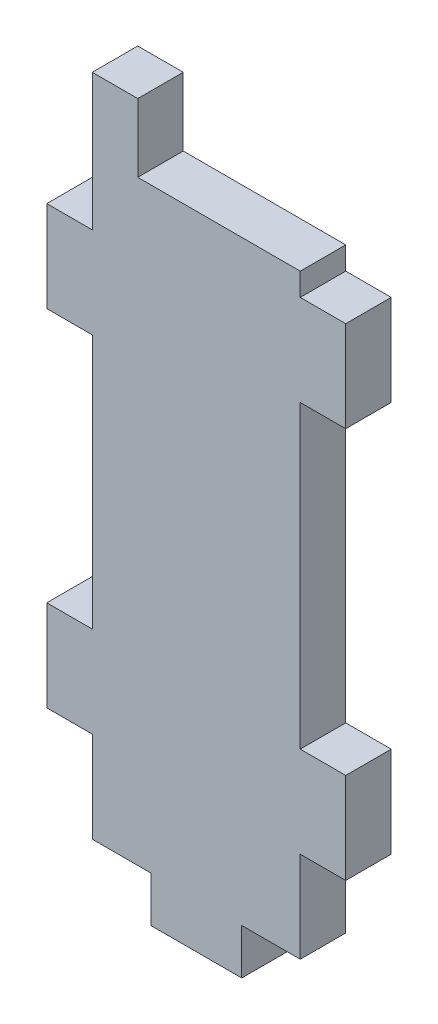
ISO-10303-21;
HEADER;
FILE_DESCRIPTION(('STEP AP214'),'2;1');
FILE_NAME('part.step','',(''),(''),'','','');
FILE_SCHEMA(('AUTOMOTIVE_DESIGN { 1 0 10303 214 1 1 1 1 }'));
ENDSEC;
DATA;
#1=APPLICATION_CONTEXT('core data for automotive mechanical design processes');
#2=APPLICATION_PROTOCOL_DEFINITION('international standard','automotive_design',2000,#1);
#3=PRODUCT_CONTEXT('',#1,'mechanical');
#4=PRODUCT('Part','Part','',(#3));
#5=PRODUCT_RELATED_PRODUCT_CATEGORY('part','',(#4));
#6=PRODUCT_DEFINITION_FORMATION('','',#4);
#7=PRODUCT_DEFINITION_CONTEXT('part definition',#1,'design');
#8=PRODUCT_DEFINITION('design','',#6,#7);
#9=PRODUCT_DEFINITION_SHAPE('','',#8);
#10=(LENGTH_UNIT() NAMED_UNIT(*) SI_UNIT(.MILLI.,.METRE.));
#11=(NAMED_UNIT(*) PLANE_ANGLE_UNIT() SI_UNIT($,.RADIAN.));
#12=(NAMED_UNIT(*) SI_UNIT($,.STERADIAN.) SOLID_ANGLE_UNIT());
#13=UNCERTAINTY_MEASURE_WITH_UNIT(LENGTH_MEASURE(1.E-05),#10,'distance_accuracy_value','');
#14=(GEOMETRIC_REPRESENTATION_CONTEXT(3) GLOBAL_UNCERTAINTY_ASSIGNED_CONTEXT((#13)) GLOBAL_UNIT_ASSIGNED_CONTEXT((#10,
#11,#12)) REPRESENTATION_CONTEXT('',''));
#15=CARTESIAN_POINT('',(0.,0.,0.));
#16=DIRECTION('',(0.,0.,1.));
#17=DIRECTION('',(1.,0.,0.));
#18=AXIS2_PLACEMENT_3D('',#15,#16,#17);
#19=CARTESIAN_POINT('',(175.817093211712,-37.0225831909852,5.));
#20=DIRECTION('',(0.,1.,0.));
#21=DIRECTION('',(0.,0.,1.));
#22=AXIS2_PLACEMENT_3D('',#19,#20,#21);
#23=PLANE('',#22);
#24=DIRECTION('',(0.,0.,1.));
#25=VECTOR('',#24,1.);
#26=CARTESIAN_POINT('',(164.387093211713,-37.0225831909852,0.));
#27=LINE('',#26,#25);
#28=CARTESIAN_POINT('',(164.387093211713,-37.0225831909852,0.));
#29=VERTEX_POINT('',#28);
#30=CARTESIAN_POINT('',(164.387093211713,-37.0225831909852,5.));
#31=VERTEX_POINT('',#30);
#32=EDGE_CURVE('E237',#29,#31,#27,.T.);
#33=ORIENTED_EDGE('',*,*,#32,.F.);
#34=DIRECTION('',(1.,0.,0.));
#35=VECTOR('',#34,1.);
#36=CARTESIAN_POINT('',(175.817093211712,-37.0225831909852,0.));
#37=LINE('',#36,#35);
#38=CARTESIAN_POINT('',(170.817093211712,-37.0225831909852,0.));
#39=VERTEX_POINT('',#38);
#40=EDGE_CURVE('E412',#29,#39,#37,.T.);
#41=ORIENTED_EDGE('',*,*,#40,.T.);
#42=DIRECTION('',(0.,0.,1.));
#43=VECTOR('',#42,1.);
#44=CARTESIAN_POINT('',(170.817093211712,-37.0225831909852,0.));
#45=LINE('',#44,#43);
#46=CARTESIAN_POINT('',(170.817093211712,-37.0225831909852,5.));
#47=VERTEX_POINT('',#46);
#48=EDGE_CURVE('E316',#39,#47,#45,.T.);
#49=ORIENTED_EDGE('',*,*,#48,.T.);
#50=DIRECTION('',(1.,0.,0.));
#51=VECTOR('',#50,1.);
#52=CARTESIAN_POINT('',(175.817093211712,-37.0225831909852,5.));
#53=LINE('',#52,#51);
#54=EDGE_CURVE('E41',#31,#47,#53,.T.);
#55=ORIENTED_EDGE('',*,*,#54,.F.);
#56=EDGE_LOOP('',(#33,#41,#49,#55));
#57=FACE_BOUND('',#56,.T.);
#58=ADVANCED_FACE('F32',(#57),#23,.F.);
#59=CARTESIAN_POINT('',(142.957093211713,35.9774168090148,5.));
#60=DIRECTION('',(1.,0.,0.));
#61=DIRECTION('',(0.,0.,-1.));
#62=AXIS2_PLACEMENT_3D('',#59,#60,#61);
#63=PLANE('',#62);
#64=DIRECTION('',(0.,-1.,0.));
#65=VECTOR('',#64,1.);
#66=CARTESIAN_POINT('',(142.957093211713,35.9774168090148,5.));
#67=LINE('',#66,#65);
#68=CARTESIAN_POINT('',(142.957093211713,20.9774168090148,5.));
#69=VERTEX_POINT('',#68);
#70=CARTESIAN_POINT('',(142.957093211713,10.9774168090148,5.));
#71=VERTEX_POINT('',#70);
#72=EDGE_CURVE('E397',#69,#71,#67,.T.);
#73=ORIENTED_EDGE('',*,*,#72,.F.);
#74=DIRECTION('',(0.,0.,1.));
#75=VECTOR('',#74,1.);
#76=CARTESIAN_POINT('',(142.957093211713,20.9774168090148,0.));
#77=LINE('',#76,#75);
#78=CARTESIAN_POINT('',(142.957093211713,20.9774168090148,0.));
#79=VERTEX_POINT('',#78);
#80=EDGE_CURVE('E251',#79,#69,#77,.T.);
#81=ORIENTED_EDGE('',*,*,#80,.F.);
#82=DIRECTION('',(0.,-1.,0.));
#83=VECTOR('',#82,1.);
#84=CARTESIAN_POINT('',(142.957093211713,35.9774168090148,0.));
#85=LINE('',#84,#83);
#86=CARTESIAN_POINT('',(142.957093211713,10.9774168090148,0.));
#87=VERTEX_POINT('',#86);
#88=EDGE_CURVE('E409',#79,#87,#85,.T.);
#89=ORIENTED_EDGE('',*,*,#88,.T.);
#90=DIRECTION('',(0.,0.,1.));
#91=VECTOR('',#90,1.);
#92=CARTESIAN_POINT('',(142.957093211713,10.9774168090148,0.));
#93=LINE('',#92,#91);
#94=EDGE_CURVE('E273',#87,#71,#93,.T.);
#95=ORIENTED_EDGE('',*,*,#94,.T.);
#96=EDGE_LOOP('',(#73,#81,#89,#95));
#97=FACE_BOUND('',#96,.T.);
#98=ADVANCED_FACE('F489',(#97),#63,.F.);
#99=CARTESIAN_POINT('',(175.817093211712,35.9774168090148,5.));
#100=DIRECTION('',(-1.,0.,0.));
#101=DIRECTION('',(0.,0.,1.));
#102=AXIS2_PLACEMENT_3D('',#99,#100,#101);
#103=PLANE('',#102);
#104=DIRECTION('',(0.,1.,0.));
#105=VECTOR('',#104,1.);
#106=CARTESIAN_POINT('',(175.817093211712,35.9774168090148,5.));
#107=LINE('',#106,#105);
#108=CARTESIAN_POINT('',(175.817093211712,15.9774168090148,5.));
#109=VERTEX_POINT('',#108);
#110=CARTESIAN_POINT('',(175.817093211712,25.9774168090148,5.));
#111=VERTEX_POINT('',#110);
#112=EDGE_CURVE('E393',#109,#111,#107,.T.);
#113=ORIENTED_EDGE('',*,*,#112,.F.);
#114=DIRECTION('',(0.,0.,1.));
#115=VECTOR('',#114,1.);
#116=CARTESIAN_POINT('',(175.817093211712,15.9774168090148,0.));
#117=LINE('',#116,#115);
#118=CARTESIAN_POINT('',(175.817093211712,15.9774168090148,0.));
#119=VERTEX_POINT('',#118);
#120=EDGE_CURVE('E349',#119,#109,#117,.T.);
#121=ORIENTED_EDGE('',*,*,#120,.F.);
#122=DIRECTION('',(0.,1.,0.));
#123=VECTOR('',#122,1.);
#124=CARTESIAN_POINT('',(175.817093211712,35.9774168090148,0.));
#125=LINE('',#124,#123);
#126=CARTESIAN_POINT('',(175.817093211712,25.9774168090148,0.));
#127=VERTEX_POINT('',#126);
#128=EDGE_CURVE('E381',#119,#127,#125,.T.);
#129=ORIENTED_EDGE('',*,*,#128,.T.);
#130=DIRECTION('',(0.,0.,1.));
#131=VECTOR('',#130,1.);
#132=CARTESIAN_POINT('',(175.817093211712,25.9774168090148,0.));
#133=LINE('',#132,#131);
#134=EDGE_CURVE('E384',#127,#111,#133,.T.);
#135=ORIENTED_EDGE('',*,*,#134,.T.);
#136=EDGE_LOOP('',(#113,#121,#129,#135));
#137=FACE_BOUND('',#136,.T.);
#138=ADVANCED_FACE('F443',(#137),#103,.F.);
#139=CARTESIAN_POINT('',(175.817093211712,-27.0225831909852,5.));
#140=VERTEX_POINT('',#139);
#141=CARTESIAN_POINT('',(175.817093211712,-17.0225831909852,5.));
#142=VERTEX_POINT('',#141);
#143=EDGE_CURVE('E390',#140,#142,#107,.T.);
#144=ORIENTED_EDGE('',*,*,#143,.F.);
#145=DIRECTION('',(0.,0.,1.));
#146=VECTOR('',#145,1.);
#147=CARTESIAN_POINT('',(175.817093211712,-27.0225831909852,0.));
#148=LINE('',#147,#146);
#149=CARTESIAN_POINT('',(175.817093211712,-27.0225831909852,0.));
#150=VERTEX_POINT('',#149);
#151=EDGE_CURVE('E324',#150,#140,#148,.T.);
#152=ORIENTED_EDGE('',*,*,#151,.F.);
#153=CARTESIAN_POINT('',(175.817093211712,-17.0225831909852,0.));
#154=VERTEX_POINT('',#153);
#155=EDGE_CURVE('E401',#150,#154,#125,.T.);
#156=ORIENTED_EDGE('',*,*,#155,.T.);
#157=DIRECTION('',(0.,0.,1.));
#158=VECTOR('',#157,1.);
#159=CARTESIAN_POINT('',(175.817093211712,-17.0225831909852,0.));
#160=LINE('',#159,#158);
#161=EDGE_CURVE('E351',#154,#142,#160,.T.);
#162=ORIENTED_EDGE('',*,*,#161,.T.);
#163=EDGE_LOOP('',(#144,#152,#156,#162));
#164=FACE_BOUND('',#163,.T.);
#165=ADVANCED_FACE('F34',(#164),#103,.F.);
#166=CARTESIAN_POINT('',(175.817093211712,35.9774168090148,5.));
#167=DIRECTION('',(0.,-1.,0.));
#168=DIRECTION('',(0.,0.,-1.));
#169=AXIS2_PLACEMENT_3D('',#166,#167,#168);
#170=PLANE('',#169);
#171=DIRECTION('',(-1.,0.,0.));
#172=VECTOR('',#171,1.);
#173=CARTESIAN_POINT('',(175.817093211712,35.9774168090148,0.));
#174=LINE('',#173,#172);
#175=CARTESIAN_POINT('',(152.957093211713,35.9774168090148,0.));
#176=VERTEX_POINT('',#175);
#177=CARTESIAN_POINT('',(147.957093211713,35.9774168090148,0.));
#178=VERTEX_POINT('',#177);
#179=EDGE_CURVE('E425',#176,#178,#174,.T.);
#180=ORIENTED_EDGE('',*,*,#179,.T.);
#181=DIRECTION('',(0.,0.,1.));
#182=VECTOR('',#181,1.);
#183=CARTESIAN_POINT('',(147.957093211713,35.9774168090148,0.));
#184=LINE('',#183,#182);
#185=CARTESIAN_POINT('',(147.957093211713,35.9774168090148,5.));
#186=VERTEX_POINT('',#185);
#187=EDGE_CURVE('E256',#178,#186,#184,.T.);
#188=ORIENTED_EDGE('',*,*,#187,.T.);
#189=DIRECTION('',(-1.,0.,0.));
#190=VECTOR('',#189,1.);
#191=CARTESIAN_POINT('',(175.817093211712,35.9774168090148,5.));
#192=LINE('',#191,#190);
#193=CARTESIAN_POINT('',(152.957093211713,35.9774168090148,5.));
#194=VERTEX_POINT('',#193);
#195=EDGE_CURVE('E392',#194,#186,#192,.T.);
#196=ORIENTED_EDGE('',*,*,#195,.F.);
#197=DIRECTION('',(0.,0.,1.));
#198=VECTOR('',#197,1.);
#199=CARTESIAN_POINT('',(152.957093211713,35.9774168090148,0.));
#200=LINE('',#199,#198);
#201=EDGE_CURVE('E382',#176,#194,#200,.T.);
#202=ORIENTED_EDGE('',*,*,#201,.F.);
#203=EDGE_LOOP('',(#180,#188,#196,#202));
#204=FACE_BOUND('',#203,.T.);
#205=ADVANCED_FACE('F504',(#204),#170,.F.);
#206=CARTESIAN_POINT('',(142.957093211713,-17.0225831909852,5.));
#207=VERTEX_POINT('',#206);
#208=CARTESIAN_POINT('',(142.957093211713,-27.0225831909852,5.));
#209=VERTEX_POINT('',#208);
#210=EDGE_CURVE('E396',#207,#209,#67,.T.);
#211=ORIENTED_EDGE('',*,*,#210,.F.);
#212=DIRECTION('',(0.,0.,1.));
#213=VECTOR('',#212,1.);
#214=CARTESIAN_POINT('',(142.957093211713,-17.0225831909852,0.));
#215=LINE('',#214,#213);
#216=CARTESIAN_POINT('',(142.957093211713,-17.0225831909852,0.));
#217=VERTEX_POINT('',#216);
#218=EDGE_CURVE('E286',#217,#207,#215,.T.);
#219=ORIENTED_EDGE('',*,*,#218,.F.);
#220=CARTESIAN_POINT('',(142.957093211713,-27.0225831909852,0.));
#221=VERTEX_POINT('',#220);
#222=EDGE_CURVE('E420',#217,#221,#85,.T.);
#223=ORIENTED_EDGE('',*,*,#222,.T.);
#224=DIRECTION('',(0.,0.,1.));
#225=VECTOR('',#224,1.);
#226=CARTESIAN_POINT('',(142.957093211713,-27.0225831909852,0.));
#227=LINE('',#226,#225);
#228=EDGE_CURVE('E297',#221,#209,#227,.T.);
#229=ORIENTED_EDGE('',*,*,#228,.T.);
#230=EDGE_LOOP('',(#211,#219,#223,#229));
#231=FACE_BOUND('',#230,.T.);
#232=ADVANCED_FACE('F496',(#231),#63,.F.);
#233=CARTESIAN_POINT('',(147.957093211713,-37.0225831909852,0.));
#234=VERTEX_POINT('',#233);
#235=CARTESIAN_POINT('',(154.387093211713,-37.0225831909852,0.));
#236=VERTEX_POINT('',#235);
#237=EDGE_CURVE('E414',#234,#236,#37,.T.);
#238=ORIENTED_EDGE('',*,*,#237,.T.);
#239=DIRECTION('',(0.,0.,1.));
#240=VECTOR('',#239,1.);
#241=CARTESIAN_POINT('',(154.387093211713,-37.0225831909852,0.));
#242=LINE('',#241,#240);
#243=CARTESIAN_POINT('',(154.387093211713,-37.0225831909852,5.));
#244=VERTEX_POINT('',#243);
#245=EDGE_CURVE('E227',#236,#244,#242,.T.);
#246=ORIENTED_EDGE('',*,*,#245,.T.);
#247=CARTESIAN_POINT('',(147.957093211713,-37.0225831909852,5.));
#248=VERTEX_POINT('',#247);
#249=EDGE_CURVE('E11',#248,#244,#53,.T.);
#250=ORIENTED_EDGE('',*,*,#249,.F.);
#251=DIRECTION('',(0.,0.,1.));
#252=VECTOR('',#251,1.);
#253=CARTESIAN_POINT('',(147.957093211713,-37.0225831909852,0.));
#254=LINE('',#253,#252);
#255=EDGE_CURVE('E305',#234,#248,#254,.T.);
#256=ORIENTED_EDGE('',*,*,#255,.F.);
#257=EDGE_LOOP('',(#238,#246,#250,#256));
#258=FACE_BOUND('',#257,.T.);
#259=ADVANCED_FACE('F491',(#258),#23,.F.);
#260=CARTESIAN_POINT('',(0.,0.,5.));
#261=DIRECTION('',(0.,0.,-1.));
#262=DIRECTION('',(-1.,0.,0.));
#263=AXIS2_PLACEMENT_3D('',#260,#261,#262);
#264=PLANE('',#263);
#265=ORIENTED_EDGE('',*,*,#195,.T.);
#266=DIRECTION('',(0.,1.,0.));
#267=VECTOR('',#266,1.);
#268=CARTESIAN_POINT('',(147.957093211713,35.9774168090148,5.));
#269=LINE('',#268,#267);
#270=CARTESIAN_POINT('',(147.957093211713,20.9774168090148,5.));
#271=VERTEX_POINT('',#270);
#272=EDGE_CURVE('E249',#271,#186,#269,.T.);
#273=ORIENTED_EDGE('',*,*,#272,.F.);
#274=DIRECTION('',(1.,0.,0.));
#275=VECTOR('',#274,1.);
#276=CARTESIAN_POINT('',(147.957093211713,20.9774168090148,5.));
#277=LINE('',#276,#275);
#278=EDGE_CURVE('E252',#69,#271,#277,.T.);
#279=ORIENTED_EDGE('',*,*,#278,.F.);
#280=ORIENTED_EDGE('',*,*,#72,.T.);
#281=DIRECTION('',(-1.,0.,0.));
#282=VECTOR('',#281,1.);
#283=CARTESIAN_POINT('',(147.957093211713,10.9774168090148,5.));
#284=LINE('',#283,#282);
#285=CARTESIAN_POINT('',(147.957093211713,10.9774168090148,5.));
#286=VERTEX_POINT('',#285);
#287=EDGE_CURVE('E259',#286,#71,#284,.T.);
#288=ORIENTED_EDGE('',*,*,#287,.F.);
#289=DIRECTION('',(0.,1.,0.));
#290=VECTOR('',#289,1.);
#291=CARTESIAN_POINT('',(147.957093211713,10.9774168090148,5.));
#292=LINE('',#291,#290);
#293=CARTESIAN_POINT('',(147.957093211713,-17.0225831909852,5.));
#294=VERTEX_POINT('',#293);
#295=EDGE_CURVE('E267',#294,#286,#292,.T.);
#296=ORIENTED_EDGE('',*,*,#295,.F.);
#297=DIRECTION('',(1.,0.,0.));
#298=VECTOR('',#297,1.);
#299=CARTESIAN_POINT('',(147.957093211713,-17.0225831909852,5.));
#300=LINE('',#299,#298);
#301=EDGE_CURVE('E276',#207,#294,#300,.T.);
#302=ORIENTED_EDGE('',*,*,#301,.F.);
#303=ORIENTED_EDGE('',*,*,#210,.T.);
#304=DIRECTION('',(-1.,0.,0.));
#305=VECTOR('',#304,1.);
#306=CARTESIAN_POINT('',(147.957093211713,-27.0225831909852,5.));
#307=LINE('',#306,#305);
#308=CARTESIAN_POINT('',(147.957093211713,-27.0225831909852,5.));
#309=VERTEX_POINT('',#308);
#310=EDGE_CURVE('E283',#309,#209,#307,.T.);
#311=ORIENTED_EDGE('',*,*,#310,.F.);
#312=DIRECTION('',(0.,1.,0.));
#313=VECTOR('',#312,1.);
#314=CARTESIAN_POINT('',(147.957093211713,-27.0225831909852,5.));
#315=LINE('',#314,#313);
#316=EDGE_CURVE('E294',#248,#309,#315,.T.);
#317=ORIENTED_EDGE('',*,*,#316,.F.);
#318=ORIENTED_EDGE('',*,*,#249,.T.);
#319=DIRECTION('',(0.,-1.,0.));
#320=VECTOR('',#319,1.);
#321=CARTESIAN_POINT('',(154.387093211713,-37.0225831909852,5.));
#322=LINE('',#321,#320);
#323=CARTESIAN_POINT('',(154.387093211713,-42.0225831909852,5.));
#324=VERTEX_POINT('',#323);
#325=EDGE_CURVE('E49',#244,#324,#322,.T.);
#326=ORIENTED_EDGE('',*,*,#325,.T.);
#327=DIRECTION('',(1.,0.,0.));
#328=VECTOR('',#327,1.);
#329=CARTESIAN_POINT('',(154.387093211713,-42.0225831909852,5.));
#330=LINE('',#329,#328);
#331=CARTESIAN_POINT('',(164.387093211713,-42.0225831909852,5.));
#332=VERTEX_POINT('',#331);
#333=EDGE_CURVE('E212',#324,#332,#330,.T.);
#334=ORIENTED_EDGE('',*,*,#333,.T.);
#335=DIRECTION('',(0.,1.,0.));
#336=VECTOR('',#335,1.);
#337=CARTESIAN_POINT('',(164.387093211713,-37.0225831909852,5.));
#338=LINE('',#337,#336);
#339=EDGE_CURVE('E228',#332,#31,#338,.T.);
#340=ORIENTED_EDGE('',*,*,#339,.T.);
#341=ORIENTED_EDGE('',*,*,#54,.T.);
#342=DIRECTION('',(0.,-1.,0.));
#343=VECTOR('',#342,1.);
#344=CARTESIAN_POINT('',(170.817093211712,-27.0225831909852,5.));
#345=LINE('',#344,#343);
#346=CARTESIAN_POINT('',(170.817093211712,-27.0225831909852,5.));
#347=VERTEX_POINT('',#346);
#348=EDGE_CURVE('E304',#347,#47,#345,.T.);
#349=ORIENTED_EDGE('',*,*,#348,.F.);
#350=DIRECTION('',(-1.,0.,0.));
#351=VECTOR('',#350,1.);
#352=CARTESIAN_POINT('',(170.817093211712,-27.0225831909852,5.));
#353=LINE('',#352,#351);
#354=EDGE_CURVE('E313',#140,#347,#353,.T.);
#355=ORIENTED_EDGE('',*,*,#354,.F.);
#356=ORIENTED_EDGE('',*,*,#143,.T.);
#357=DIRECTION('',(1.,0.,0.));
#358=VECTOR('',#357,1.);
#359=CARTESIAN_POINT('',(170.817093211712,-17.0225831909852,5.));
#360=LINE('',#359,#358);
#361=CARTESIAN_POINT('',(170.817093211712,-17.0225831909852,5.));
#362=VERTEX_POINT('',#361);
#363=EDGE_CURVE('E341',#362,#142,#360,.T.);
#364=ORIENTED_EDGE('',*,*,#363,.F.);
#365=DIRECTION('',(0.,-1.,0.));
#366=VECTOR('',#365,1.);
#367=CARTESIAN_POINT('',(170.817093211712,15.9774168090148,5.));
#368=LINE('',#367,#366);
#369=CARTESIAN_POINT('',(170.817093211712,15.9774168090148,5.));
#370=VERTEX_POINT('',#369);
#371=EDGE_CURVE('E323',#370,#362,#368,.T.);
#372=ORIENTED_EDGE('',*,*,#371,.F.);
#373=DIRECTION('',(-1.,0.,0.));
#374=VECTOR('',#373,1.);
#375=CARTESIAN_POINT('',(170.817093211712,15.9774168090148,5.));
#376=LINE('',#375,#374);
#377=EDGE_CURVE('E332',#109,#370,#376,.T.);
#378=ORIENTED_EDGE('',*,*,#377,.F.);
#379=ORIENTED_EDGE('',*,*,#112,.T.);
#380=DIRECTION('',(1.,0.,0.));
#381=VECTOR('',#380,1.);
#382=CARTESIAN_POINT('',(170.817093211712,25.9774168090148,5.));
#383=LINE('',#382,#381);
#384=CARTESIAN_POINT('',(170.817093211712,25.9774168090148,5.));
#385=VERTEX_POINT('',#384);
#386=EDGE_CURVE('E374',#385,#111,#383,.T.);
#387=ORIENTED_EDGE('',*,*,#386,.F.);
#388=DIRECTION('',(-1.33226762955018E-13,-1.,0.));
#389=VECTOR('',#388,1.);
#390=CARTESIAN_POINT('',(170.817093211712,25.9774168090148,5.));
#391=LINE('',#390,#389);
#392=CARTESIAN_POINT('',(170.817093211712,28.4774168090148,5.));
#393=VERTEX_POINT('',#392);
#394=EDGE_CURVE('E371',#393,#385,#391,.T.);
#395=ORIENTED_EDGE('',*,*,#394,.F.);
#396=DIRECTION('',(1.,0.,0.));
#397=VECTOR('',#396,1.);
#398=CARTESIAN_POINT('',(170.817093211712,28.4774168090148,5.));
#399=LINE('',#398,#397);
#400=CARTESIAN_POINT('',(152.957093211713,28.4774168090148,5.));
#401=VERTEX_POINT('',#400);
#402=EDGE_CURVE('E348',#401,#393,#399,.T.);
#403=ORIENTED_EDGE('',*,*,#402,.F.);
#404=DIRECTION('',(0.,-1.,0.));
#405=VECTOR('',#404,1.);
#406=CARTESIAN_POINT('',(152.957093211713,28.4774168090148,5.));
#407=LINE('',#406,#405);
#408=EDGE_CURVE('E359',#194,#401,#407,.T.);
#409=ORIENTED_EDGE('',*,*,#408,.F.);
#410=EDGE_LOOP('',(#265,#273,#279,#280,#288,#296,#302,#303,#311,#317,#318,#326,#334,#340,#341,
#349,#355,#356,#364,#372,#378,#379,#387,#395,#403,#409));
#411=FACE_BOUND('',#410,.T.);
#412=ADVANCED_FACE('F455',(#411),#264,.F.);
#413=CARTESIAN_POINT('',(0.,0.,0.));
#414=DIRECTION('',(0.,0.,-1.));
#415=DIRECTION('',(-1.,0.,0.));
#416=AXIS2_PLACEMENT_3D('',#413,#414,#415);
#417=PLANE('',#416);
#418=DIRECTION('',(0.,1.,0.));
#419=VECTOR('',#418,1.);
#420=CARTESIAN_POINT('',(147.957093211713,35.9774168090148,0.));
#421=LINE('',#420,#419);
#422=CARTESIAN_POINT('',(147.957093211713,20.9774168090148,0.));
#423=VERTEX_POINT('',#422);
#424=EDGE_CURVE('E57',#423,#178,#421,.T.);
#425=ORIENTED_EDGE('',*,*,#424,.T.);
#426=ORIENTED_EDGE('',*,*,#179,.F.);
#427=DIRECTION('',(0.,-1.,0.));
#428=VECTOR('',#427,1.);
#429=CARTESIAN_POINT('',(152.957093211713,28.4774168090148,0.));
#430=LINE('',#429,#428);
#431=CARTESIAN_POINT('',(152.957093211713,28.4774168090148,0.));
#432=VERTEX_POINT('',#431);
#433=EDGE_CURVE('E365',#176,#432,#430,.T.);
#434=ORIENTED_EDGE('',*,*,#433,.T.);
#435=DIRECTION('',(1.,0.,0.));
#436=VECTOR('',#435,1.);
#437=CARTESIAN_POINT('',(170.817093211712,28.4774168090148,0.));
#438=LINE('',#437,#436);
#439=CARTESIAN_POINT('',(170.817093211712,28.4774168090148,0.));
#440=VERTEX_POINT('',#439);
#441=EDGE_CURVE('E355',#432,#440,#438,.T.);
#442=ORIENTED_EDGE('',*,*,#441,.T.);
#443=DIRECTION('',(-1.33226762955018E-13,-1.,0.));
#444=VECTOR('',#443,1.);
#445=CARTESIAN_POINT('',(170.817093211712,25.9774168090148,0.));
#446=LINE('',#445,#444);
#447=CARTESIAN_POINT('',(170.817093211712,25.9774168090148,0.));
#448=VERTEX_POINT('',#447);
#449=EDGE_CURVE('E358',#440,#448,#446,.T.);
#450=ORIENTED_EDGE('',*,*,#449,.T.);
#451=DIRECTION('',(1.,0.,0.));
#452=VECTOR('',#451,1.);
#453=CARTESIAN_POINT('',(170.817093211712,25.9774168090148,0.));
#454=LINE('',#453,#452);
#455=EDGE_CURVE('E362',#448,#127,#454,.T.);
#456=ORIENTED_EDGE('',*,*,#455,.T.);
#457=ORIENTED_EDGE('',*,*,#128,.F.);
#458=DIRECTION('',(-1.,0.,0.));
#459=VECTOR('',#458,1.);
#460=CARTESIAN_POINT('',(170.817093211712,15.9774168090148,0.));
#461=LINE('',#460,#459);
#462=CARTESIAN_POINT('',(170.817093211712,15.9774168090148,0.));
#463=VERTEX_POINT('',#462);
#464=EDGE_CURVE('E335',#119,#463,#461,.T.);
#465=ORIENTED_EDGE('',*,*,#464,.T.);
#466=DIRECTION('',(0.,-1.,0.));
#467=VECTOR('',#466,1.);
#468=CARTESIAN_POINT('',(170.817093211712,15.9774168090148,0.));
#469=LINE('',#468,#467);
#470=CARTESIAN_POINT('',(170.817093211712,-17.0225831909852,0.));
#471=VERTEX_POINT('',#470);
#472=EDGE_CURVE('E328',#463,#471,#469,.T.);
#473=ORIENTED_EDGE('',*,*,#472,.T.);
#474=DIRECTION('',(1.,0.,0.));
#475=VECTOR('',#474,1.);
#476=CARTESIAN_POINT('',(170.817093211712,-17.0225831909852,0.));
#477=LINE('',#476,#475);
#478=EDGE_CURVE('E331',#471,#154,#477,.T.);
#479=ORIENTED_EDGE('',*,*,#478,.T.);
#480=ORIENTED_EDGE('',*,*,#155,.F.);
#481=DIRECTION('',(-1.,0.,0.));
#482=VECTOR('',#481,1.);
#483=CARTESIAN_POINT('',(170.817093211712,-27.0225831909852,0.));
#484=LINE('',#483,#482);
#485=CARTESIAN_POINT('',(170.817093211712,-27.0225831909852,0.));
#486=VERTEX_POINT('',#485);
#487=EDGE_CURVE('E312',#150,#486,#484,.T.);
#488=ORIENTED_EDGE('',*,*,#487,.T.);
#489=DIRECTION('',(0.,-1.,0.));
#490=VECTOR('',#489,1.);
#491=CARTESIAN_POINT('',(170.817093211712,-27.0225831909852,0.));
#492=LINE('',#491,#490);
#493=EDGE_CURVE('E309',#486,#39,#492,.T.);
#494=ORIENTED_EDGE('',*,*,#493,.T.);
#495=ORIENTED_EDGE('',*,*,#40,.F.);
#496=DIRECTION('',(0.,1.,0.));
#497=VECTOR('',#496,1.);
#498=CARTESIAN_POINT('',(164.387093211713,-37.0225831909852,0.));
#499=LINE('',#498,#497);
#500=CARTESIAN_POINT('',(164.387093211713,-42.0225831909852,0.));
#501=VERTEX_POINT('',#500);
#502=EDGE_CURVE('E215',#501,#29,#499,.T.);
#503=ORIENTED_EDGE('',*,*,#502,.F.);
#504=DIRECTION('',(1.,0.,0.));
#505=VECTOR('',#504,1.);
#506=CARTESIAN_POINT('',(154.387093211713,-42.0225831909852,0.));
#507=LINE('',#506,#505);
#508=CARTESIAN_POINT('',(154.387093211713,-42.0225831909852,0.));
#509=VERTEX_POINT('',#508);
#510=EDGE_CURVE('E210',#509,#501,#507,.T.);
#511=ORIENTED_EDGE('',*,*,#510,.F.);
#512=DIRECTION('',(0.,-1.,0.));
#513=VECTOR('',#512,1.);
#514=CARTESIAN_POINT('',(154.387093211713,-37.0225831909852,0.));
#515=LINE('',#514,#513);
#516=EDGE_CURVE('E222',#236,#509,#515,.T.);
#517=ORIENTED_EDGE('',*,*,#516,.F.);
#518=ORIENTED_EDGE('',*,*,#237,.F.);
#519=DIRECTION('',(0.,1.,0.));
#520=VECTOR('',#519,1.);
#521=CARTESIAN_POINT('',(147.957093211713,-27.0225831909852,0.));
#522=LINE('',#521,#520);
#523=CARTESIAN_POINT('',(147.957093211713,-27.0225831909852,0.));
#524=VERTEX_POINT('',#523);
#525=EDGE_CURVE('E293',#234,#524,#522,.T.);
#526=ORIENTED_EDGE('',*,*,#525,.T.);
#527=DIRECTION('',(-1.,0.,0.));
#528=VECTOR('',#527,1.);
#529=CARTESIAN_POINT('',(147.957093211713,-27.0225831909852,0.));
#530=LINE('',#529,#528);
#531=EDGE_CURVE('E290',#524,#221,#530,.T.);
#532=ORIENTED_EDGE('',*,*,#531,.T.);
#533=ORIENTED_EDGE('',*,*,#222,.F.);
#534=DIRECTION('',(1.,0.,0.));
#535=VECTOR('',#534,1.);
#536=CARTESIAN_POINT('',(147.957093211713,-17.0225831909852,0.));
#537=LINE('',#536,#535);
#538=CARTESIAN_POINT('',(147.957093211713,-17.0225831909852,0.));
#539=VERTEX_POINT('',#538);
#540=EDGE_CURVE('E266',#217,#539,#537,.T.);
#541=ORIENTED_EDGE('',*,*,#540,.T.);
#542=DIRECTION('',(0.,1.,0.));
#543=VECTOR('',#542,1.);
#544=CARTESIAN_POINT('',(147.957093211713,10.9774168090148,0.));
#545=LINE('',#544,#543);
#546=CARTESIAN_POINT('',(147.957093211713,10.9774168090148,0.));
#547=VERTEX_POINT('',#546);
#548=EDGE_CURVE('E270',#539,#547,#545,.T.);
#549=ORIENTED_EDGE('',*,*,#548,.T.);
#550=DIRECTION('',(-1.,0.,0.));
#551=VECTOR('',#550,1.);
#552=CARTESIAN_POINT('',(147.957093211713,10.9774168090148,0.));
#553=LINE('',#552,#551);
#554=EDGE_CURVE('E263',#547,#87,#553,.T.);
#555=ORIENTED_EDGE('',*,*,#554,.T.);
#556=ORIENTED_EDGE('',*,*,#88,.F.);
#557=DIRECTION('',(1.,0.,0.));
#558=VECTOR('',#557,1.);
#559=CARTESIAN_POINT('',(147.957093211713,20.9774168090148,0.));
#560=LINE('',#559,#558);
#561=EDGE_CURVE('E246',#79,#423,#560,.T.);
#562=ORIENTED_EDGE('',*,*,#561,.T.);
#563=EDGE_LOOP('',(#425,#426,#434,#442,#450,#456,#457,#465,#473,#479,#480,#488,#494,#495,#503,
#511,#517,#518,#526,#532,#533,#541,#549,#555,#556,#562));
#564=FACE_BOUND('',#563,.T.);
#565=ADVANCED_FACE('F220',(#564),#417,.T.);
#566=CARTESIAN_POINT('',(170.817093211712,28.4774168090148,0.));
#567=DIRECTION('',(0.,-1.,0.));
#568=DIRECTION('',(1.,0.,0.));
#569=AXIS2_PLACEMENT_3D('',#566,#567,#568);
#570=PLANE('',#569);
#571=ORIENTED_EDGE('',*,*,#402,.T.);
#572=DIRECTION('',(0.,0.,1.));
#573=VECTOR('',#572,1.);
#574=CARTESIAN_POINT('',(170.817093211712,28.4774168090148,0.));
#575=LINE('',#574,#573);
#576=EDGE_CURVE('E368',#440,#393,#575,.T.);
#577=ORIENTED_EDGE('',*,*,#576,.F.);
#578=ORIENTED_EDGE('',*,*,#441,.F.);
#579=DIRECTION('',(0.,0.,1.));
#580=VECTOR('',#579,1.);
#581=CARTESIAN_POINT('',(152.957093211713,28.4774168090148,0.));
#582=LINE('',#581,#580);
#583=EDGE_CURVE('E379',#432,#401,#582,.T.);
#584=ORIENTED_EDGE('',*,*,#583,.T.);
#585=EDGE_LOOP('',(#571,#577,#578,#584));
#586=FACE_BOUND('',#585,.T.);
#587=ADVANCED_FACE('F538',(#586),#570,.F.);
#588=CARTESIAN_POINT('',(152.957093211713,28.4774168090148,0.));
#589=DIRECTION('',(-1.,0.,0.));
#590=DIRECTION('',(0.,0.,1.));
#591=AXIS2_PLACEMENT_3D('',#588,#589,#590);
#592=PLANE('',#591);
#593=ORIENTED_EDGE('',*,*,#408,.T.);
#594=ORIENTED_EDGE('',*,*,#583,.F.);
#595=ORIENTED_EDGE('',*,*,#433,.F.);
#596=ORIENTED_EDGE('',*,*,#201,.T.);
#597=EDGE_LOOP('',(#593,#594,#595,#596));
#598=FACE_BOUND('',#597,.T.);
#599=ADVANCED_FACE('F536',(#598),#592,.F.);
#600=CARTESIAN_POINT('',(170.817093211712,25.9774168090148,0.));
#601=DIRECTION('',(0.,-1.,0.));
#602=DIRECTION('',(0.,0.,-1.));
#603=AXIS2_PLACEMENT_3D('',#600,#601,#602);
#604=PLANE('',#603);
#605=ORIENTED_EDGE('',*,*,#386,.T.);
#606=ORIENTED_EDGE('',*,*,#134,.F.);
#607=ORIENTED_EDGE('',*,*,#455,.F.);
#608=DIRECTION('',(0.,0.,1.));
#609=VECTOR('',#608,1.);
#610=CARTESIAN_POINT('',(170.817093211712,25.9774168090148,0.));
#611=LINE('',#610,#609);
#612=EDGE_CURVE('E387',#448,#385,#611,.T.);
#613=ORIENTED_EDGE('',*,*,#612,.T.);
#614=EDGE_LOOP('',(#605,#606,#607,#613));
#615=FACE_BOUND('',#614,.T.);
#616=ADVANCED_FACE('F445',(#615),#604,.F.);
#617=CARTESIAN_POINT('',(170.817093211712,25.9774168090148,0.));
#618=DIRECTION('',(-1.,1.33226762955018E-13,0.));
#619=DIRECTION('',(-1.33226762955018E-13,-1.,0.));
#620=AXIS2_PLACEMENT_3D('',#617,#618,#619);
#621=PLANE('',#620);
#622=ORIENTED_EDGE('',*,*,#394,.T.);
#623=ORIENTED_EDGE('',*,*,#612,.F.);
#624=ORIENTED_EDGE('',*,*,#449,.F.);
#625=ORIENTED_EDGE('',*,*,#576,.T.);
#626=EDGE_LOOP('',(#622,#623,#624,#625));
#627=FACE_BOUND('',#626,.T.);
#628=ADVANCED_FACE('F451',(#627),#621,.F.);
#629=CARTESIAN_POINT('',(170.817093211712,15.9774168090148,0.));
#630=DIRECTION('',(-1.,0.,0.));
#631=DIRECTION('',(0.,0.,1.));
#632=AXIS2_PLACEMENT_3D('',#629,#630,#631);
#633=PLANE('',#632);
#634=ORIENTED_EDGE('',*,*,#371,.T.);
#635=DIRECTION('',(0.,0.,1.));
#636=VECTOR('',#635,1.);
#637=CARTESIAN_POINT('',(170.817093211712,-17.0225831909852,0.));
#638=LINE('',#637,#636);
#639=EDGE_CURVE('E338',#471,#362,#638,.T.);
#640=ORIENTED_EDGE('',*,*,#639,.F.);
#641=ORIENTED_EDGE('',*,*,#472,.F.);
#642=DIRECTION('',(0.,0.,1.));
#643=VECTOR('',#642,1.);
#644=CARTESIAN_POINT('',(170.817093211712,15.9774168090148,0.));
#645=LINE('',#644,#643);
#646=EDGE_CURVE('E346',#463,#370,#645,.T.);
#647=ORIENTED_EDGE('',*,*,#646,.T.);
#648=EDGE_LOOP('',(#634,#640,#641,#647));
#649=FACE_BOUND('',#648,.T.);
#650=ADVANCED_FACE('F464',(#649),#633,.F.);
#651=CARTESIAN_POINT('',(170.817093211712,15.9774168090148,0.));
#652=DIRECTION('',(0.,1.,0.));
#653=DIRECTION('',(0.,0.,1.));
#654=AXIS2_PLACEMENT_3D('',#651,#652,#653);
#655=PLANE('',#654);
#656=ORIENTED_EDGE('',*,*,#377,.T.);
#657=ORIENTED_EDGE('',*,*,#646,.F.);
#658=ORIENTED_EDGE('',*,*,#464,.F.);
#659=ORIENTED_EDGE('',*,*,#120,.T.);
#660=EDGE_LOOP('',(#656,#657,#658,#659));
#661=FACE_BOUND('',#660,.T.);
#662=ADVANCED_FACE('F460',(#661),#655,.F.);
#663=CARTESIAN_POINT('',(170.817093211712,-17.0225831909852,0.));
#664=DIRECTION('',(0.,-1.,0.));
#665=DIRECTION('',(0.,0.,-1.));
#666=AXIS2_PLACEMENT_3D('',#663,#664,#665);
#667=PLANE('',#666);
#668=ORIENTED_EDGE('',*,*,#363,.T.);
#669=ORIENTED_EDGE('',*,*,#161,.F.);
#670=ORIENTED_EDGE('',*,*,#478,.F.);
#671=ORIENTED_EDGE('',*,*,#639,.T.);
#672=EDGE_LOOP('',(#668,#669,#670,#671));
#673=FACE_BOUND('',#672,.T.);
#674=ADVANCED_FACE('F466',(#673),#667,.F.);
#675=CARTESIAN_POINT('',(170.817093211712,-27.0225831909852,0.));
#676=DIRECTION('',(-1.,0.,0.));
#677=DIRECTION('',(0.,0.,1.));
#678=AXIS2_PLACEMENT_3D('',#675,#676,#677);
#679=PLANE('',#678);
#680=ORIENTED_EDGE('',*,*,#348,.T.);
#681=ORIENTED_EDGE('',*,*,#48,.F.);
#682=ORIENTED_EDGE('',*,*,#493,.F.);
#683=DIRECTION('',(0.,0.,1.));
#684=VECTOR('',#683,1.);
#685=CARTESIAN_POINT('',(170.817093211712,-27.0225831909852,0.));
#686=LINE('',#685,#684);
#687=EDGE_CURVE('E321',#486,#347,#686,.T.);
#688=ORIENTED_EDGE('',*,*,#687,.T.);
#689=EDGE_LOOP('',(#680,#681,#682,#688));
#690=FACE_BOUND('',#689,.T.);
#691=ADVANCED_FACE('F474',(#690),#679,.F.);
#692=CARTESIAN_POINT('',(170.817093211712,-27.0225831909852,0.));
#693=DIRECTION('',(0.,1.,0.));
#694=DIRECTION('',(0.,0.,1.));
#695=AXIS2_PLACEMENT_3D('',#692,#693,#694);
#696=PLANE('',#695);
#697=ORIENTED_EDGE('',*,*,#354,.T.);
#698=ORIENTED_EDGE('',*,*,#687,.F.);
#699=ORIENTED_EDGE('',*,*,#487,.F.);
#700=ORIENTED_EDGE('',*,*,#151,.T.);
#701=EDGE_LOOP('',(#697,#698,#699,#700));
#702=FACE_BOUND('',#701,.T.);
#703=ADVANCED_FACE('F472',(#702),#696,.F.);
#704=CARTESIAN_POINT('',(147.957093211713,-27.0225831909852,0.));
#705=DIRECTION('',(0.,1.,0.));
#706=DIRECTION('',(0.,0.,1.));
#707=AXIS2_PLACEMENT_3D('',#704,#705,#706);
#708=PLANE('',#707);
#709=ORIENTED_EDGE('',*,*,#310,.T.);
#710=ORIENTED_EDGE('',*,*,#228,.F.);
#711=ORIENTED_EDGE('',*,*,#531,.F.);
#712=DIRECTION('',(0.,0.,1.));
#713=VECTOR('',#712,1.);
#714=CARTESIAN_POINT('',(147.957093211713,-27.0225831909852,0.));
#715=LINE('',#714,#713);
#716=EDGE_CURVE('E302',#524,#309,#715,.T.);
#717=ORIENTED_EDGE('',*,*,#716,.T.);
#718=EDGE_LOOP('',(#709,#710,#711,#717));
#719=FACE_BOUND('',#718,.T.);
#720=ADVANCED_FACE('F514',(#719),#708,.F.);
#721=CARTESIAN_POINT('',(147.957093211713,-27.0225831909852,0.));
#722=DIRECTION('',(1.,0.,0.));
#723=DIRECTION('',(0.,0.,-1.));
#724=AXIS2_PLACEMENT_3D('',#721,#722,#723);
#725=PLANE('',#724);
#726=ORIENTED_EDGE('',*,*,#316,.T.);
#727=ORIENTED_EDGE('',*,*,#716,.F.);
#728=ORIENTED_EDGE('',*,*,#525,.F.);
#729=ORIENTED_EDGE('',*,*,#255,.T.);
#730=EDGE_LOOP('',(#726,#727,#728,#729));
#731=FACE_BOUND('',#730,.T.);
#732=ADVANCED_FACE('F517',(#731),#725,.F.);
#733=CARTESIAN_POINT('',(147.957093211713,10.9774168090148,0.));
#734=DIRECTION('',(0.,1.,0.));
#735=DIRECTION('',(0.,0.,1.));
#736=AXIS2_PLACEMENT_3D('',#733,#734,#735);
#737=PLANE('',#736);
#738=ORIENTED_EDGE('',*,*,#287,.T.);
#739=ORIENTED_EDGE('',*,*,#94,.F.);
#740=ORIENTED_EDGE('',*,*,#554,.F.);
#741=DIRECTION('',(0.,0.,1.));
#742=VECTOR('',#741,1.);
#743=CARTESIAN_POINT('',(147.957093211713,10.9774168090148,0.));
#744=LINE('',#743,#742);
#745=EDGE_CURVE('E281',#547,#286,#744,.T.);
#746=ORIENTED_EDGE('',*,*,#745,.T.);
#747=EDGE_LOOP('',(#738,#739,#740,#746));
#748=FACE_BOUND('',#747,.T.);
#749=ADVANCED_FACE('F527',(#748),#737,.F.);
#750=CARTESIAN_POINT('',(147.957093211713,10.9774168090148,0.));
#751=DIRECTION('',(1.,0.,0.));
#752=DIRECTION('',(0.,1.,0.));
#753=AXIS2_PLACEMENT_3D('',#750,#751,#752);
#754=PLANE('',#753);
#755=ORIENTED_EDGE('',*,*,#295,.T.);
#756=ORIENTED_EDGE('',*,*,#745,.F.);
#757=ORIENTED_EDGE('',*,*,#548,.F.);
#758=DIRECTION('',(0.,0.,1.));
#759=VECTOR('',#758,1.);
#760=CARTESIAN_POINT('',(147.957093211713,-17.0225831909852,0.));
#761=LINE('',#760,#759);
#762=EDGE_CURVE('E284',#539,#294,#761,.T.);
#763=ORIENTED_EDGE('',*,*,#762,.T.);
#764=EDGE_LOOP('',(#755,#756,#757,#763));
#765=FACE_BOUND('',#764,.T.);
#766=ADVANCED_FACE('F523',(#765),#754,.F.);
#767=CARTESIAN_POINT('',(147.957093211713,-17.0225831909852,0.));
#768=DIRECTION('',(0.,-1.,0.));
#769=DIRECTION('',(0.,0.,-1.));
#770=AXIS2_PLACEMENT_3D('',#767,#768,#769);
#771=PLANE('',#770);
#772=ORIENTED_EDGE('',*,*,#301,.T.);
#773=ORIENTED_EDGE('',*,*,#762,.F.);
#774=ORIENTED_EDGE('',*,*,#540,.F.);
#775=ORIENTED_EDGE('',*,*,#218,.T.);
#776=EDGE_LOOP('',(#772,#773,#774,#775));
#777=FACE_BOUND('',#776,.T.);
#778=ADVANCED_FACE('F521',(#777),#771,.F.);
#779=CARTESIAN_POINT('',(147.957093211713,35.9774168090148,0.));
#780=DIRECTION('',(1.,0.,0.));
#781=DIRECTION('',(0.,0.,-1.));
#782=AXIS2_PLACEMENT_3D('',#779,#780,#781);
#783=PLANE('',#782);
#784=ORIENTED_EDGE('',*,*,#272,.T.);
#785=ORIENTED_EDGE('',*,*,#187,.F.);
#786=ORIENTED_EDGE('',*,*,#424,.F.);
#787=DIRECTION('',(0.,0.,1.));
#788=VECTOR('',#787,1.);
#789=CARTESIAN_POINT('',(147.957093211713,20.9774168090148,0.));
#790=LINE('',#789,#788);
#791=EDGE_CURVE('E260',#423,#271,#790,.T.);
#792=ORIENTED_EDGE('',*,*,#791,.T.);
#793=EDGE_LOOP('',(#784,#785,#786,#792));
#794=FACE_BOUND('',#793,.T.);
#795=ADVANCED_FACE('F534',(#794),#783,.F.);
#796=CARTESIAN_POINT('',(147.957093211713,20.9774168090148,0.));
#797=DIRECTION('',(0.,-1.,0.));
#798=DIRECTION('',(0.,0.,-1.));
#799=AXIS2_PLACEMENT_3D('',#796,#797,#798);
#800=PLANE('',#799);
#801=ORIENTED_EDGE('',*,*,#278,.T.);
#802=ORIENTED_EDGE('',*,*,#791,.F.);
#803=ORIENTED_EDGE('',*,*,#561,.F.);
#804=ORIENTED_EDGE('',*,*,#80,.T.);
#805=EDGE_LOOP('',(#801,#802,#803,#804));
#806=FACE_BOUND('',#805,.T.);
#807=ADVANCED_FACE('F486',(#806),#800,.F.);
#808=CARTESIAN_POINT('',(154.387093211713,-37.0225831909852,0.));
#809=DIRECTION('',(-1.,0.,0.));
#810=DIRECTION('',(0.,0.,1.));
#811=AXIS2_PLACEMENT_3D('',#808,#809,#810);
#812=PLANE('',#811);
#813=ORIENTED_EDGE('',*,*,#325,.F.);
#814=ORIENTED_EDGE('',*,*,#245,.F.);
#815=ORIENTED_EDGE('',*,*,#516,.T.);
#816=DIRECTION('',(0.,0.,1.));
#817=VECTOR('',#816,1.);
#818=CARTESIAN_POINT('',(154.387093211713,-42.0225831909852,0.));
#819=LINE('',#818,#817);
#820=EDGE_CURVE('E207',#509,#324,#819,.T.);
#821=ORIENTED_EDGE('',*,*,#820,.T.);
#822=EDGE_LOOP('',(#813,#814,#815,#821));
#823=FACE_BOUND('',#822,.T.);
#824=ADVANCED_FACE('F226',(#823),#812,.T.);
#825=CARTESIAN_POINT('',(164.387093211713,-37.0225831909852,0.));
#826=DIRECTION('',(1.,0.,0.));
#827=DIRECTION('',(0.,0.,-1.));
#828=AXIS2_PLACEMENT_3D('',#825,#826,#827);
#829=PLANE('',#828);
#830=ORIENTED_EDGE('',*,*,#339,.F.);
#831=DIRECTION('',(0.,0.,1.));
#832=VECTOR('',#831,1.);
#833=CARTESIAN_POINT('',(164.387093211713,-42.0225831909852,0.));
#834=LINE('',#833,#832);
#835=EDGE_CURVE('E214',#501,#332,#834,.T.);
#836=ORIENTED_EDGE('',*,*,#835,.F.);
#837=ORIENTED_EDGE('',*,*,#502,.T.);
#838=ORIENTED_EDGE('',*,*,#32,.T.);
#839=EDGE_LOOP('',(#830,#836,#837,#838));
#840=FACE_BOUND('',#839,.T.);
#841=ADVANCED_FACE('F478',(#840),#829,.T.);
#842=CARTESIAN_POINT('',(154.387093211713,-42.0225831909852,0.));
#843=DIRECTION('',(0.,-1.,0.));
#844=DIRECTION('',(0.,0.,-1.));
#845=AXIS2_PLACEMENT_3D('',#842,#843,#844);
#846=PLANE('',#845);
#847=ORIENTED_EDGE('',*,*,#333,.F.);
#848=ORIENTED_EDGE('',*,*,#820,.F.);
#849=ORIENTED_EDGE('',*,*,#510,.T.);
#850=ORIENTED_EDGE('',*,*,#835,.T.);
#851=EDGE_LOOP('',(#847,#848,#849,#850));
#852=FACE_BOUND('',#851,.T.);
#853=ADVANCED_FACE('F209',(#852),#846,.T.);
#854=CLOSED_SHELL('',(#58,#98,#138,#165,#205,#232,#259,#412,#565,#587,#599,#616,#628,#650,#662,
#674,#691,#703,#720,#732,#749,#766,#778,#795,#807,#824,#841,#853));
#855=MANIFOLD_SOLID_BREP('B2',#854);
#856=ADVANCED_BREP_SHAPE_REPRESENTATION('',(#18,#855),#14);
#857=SHAPE_DEFINITION_REPRESENTATION(#9,#856);
ENDSEC;
END-ISO-10303-21;
